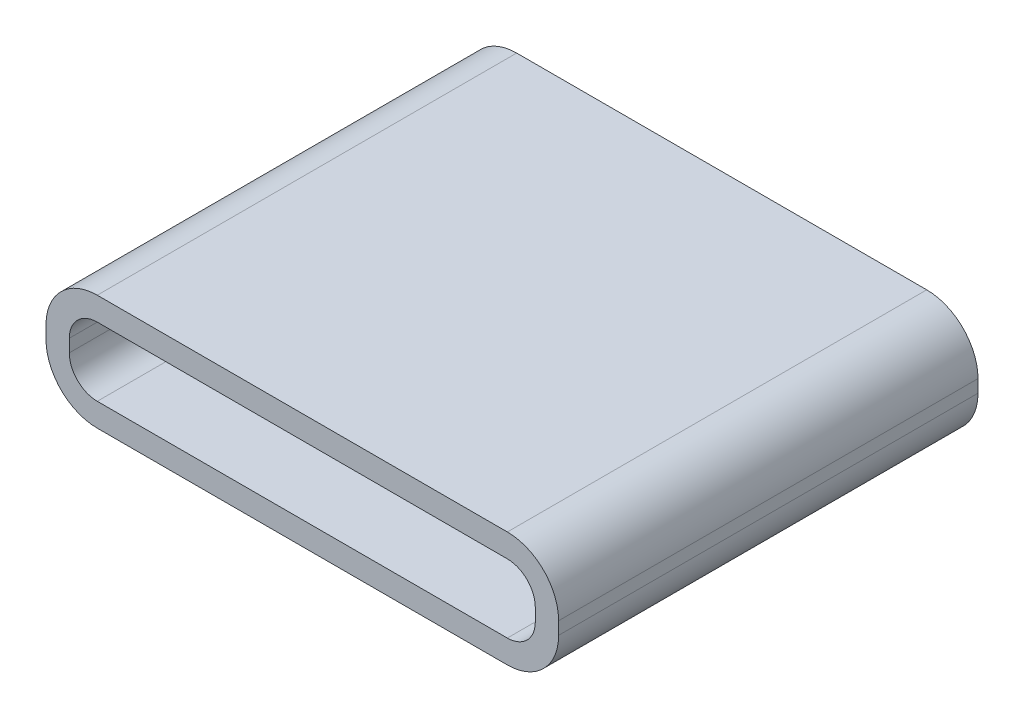
ISO-10303-21;
HEADER;
FILE_DESCRIPTION(('STEP AP214'),'2;1');
FILE_NAME('part.step','',(''),(''),'','','');
FILE_SCHEMA(('AUTOMOTIVE_DESIGN { 1 0 10303 214 1 1 1 1 }'));
ENDSEC;
DATA;
#1=APPLICATION_CONTEXT('core data for automotive mechanical design processes');
#2=APPLICATION_PROTOCOL_DEFINITION('international standard','automotive_design',2000,#1);
#3=PRODUCT_CONTEXT('',#1,'mechanical');
#4=PRODUCT('Part','Part','',(#3));
#5=PRODUCT_RELATED_PRODUCT_CATEGORY('part','',(#4));
#6=PRODUCT_DEFINITION_FORMATION('','',#4);
#7=PRODUCT_DEFINITION_CONTEXT('part definition',#1,'design');
#8=PRODUCT_DEFINITION('design','',#6,#7);
#9=PRODUCT_DEFINITION_SHAPE('','',#8);
#10=(LENGTH_UNIT() NAMED_UNIT(*) SI_UNIT(.MILLI.,.METRE.));
#11=(NAMED_UNIT(*) PLANE_ANGLE_UNIT() SI_UNIT($,.RADIAN.));
#12=(NAMED_UNIT(*) SI_UNIT($,.STERADIAN.) SOLID_ANGLE_UNIT());
#13=UNCERTAINTY_MEASURE_WITH_UNIT(LENGTH_MEASURE(1.E-05),#10,'distance_accuracy_value','');
#14=(GEOMETRIC_REPRESENTATION_CONTEXT(3) GLOBAL_UNCERTAINTY_ASSIGNED_CONTEXT((#13)) GLOBAL_UNIT_ASSIGNED_CONTEXT((#10,
#11,#12)) REPRESENTATION_CONTEXT('',''));
#15=CARTESIAN_POINT('',(0.,0.,0.));
#16=DIRECTION('',(0.,0.,1.));
#17=DIRECTION('',(1.,0.,0.));
#18=AXIS2_PLACEMENT_3D('',#15,#16,#17);
#19=CARTESIAN_POINT('',(5.,18.5812085158056,450.));
#20=DIRECTION('',(0.,0.,-1.));
#21=DIRECTION('',(-1.,0.,0.));
#22=AXIS2_PLACEMENT_3D('',#19,#20,#21);
#23=PLANE('',#22);
#24=CARTESIAN_POINT('',(5.,18.5812085158056,450.));
#25=DIRECTION('',(0.,0.,1.));
#26=DIRECTION('',(-1.,0.,0.));
#27=AXIS2_PLACEMENT_3D('',#24,#25,#26);
#28=CIRCLE('',#27,55.);
#29=CARTESIAN_POINT('',(5.,73.5812085158056,450.));
#30=VERTEX_POINT('',#29);
#31=CARTESIAN_POINT('',(-50.,18.5812085158056,450.));
#32=VERTEX_POINT('',#31);
#33=EDGE_CURVE('E248',#30,#32,#28,.T.);
#34=ORIENTED_EDGE('',*,*,#33,.T.);
#35=DIRECTION('',(0.,-1.,0.));
#36=VECTOR('',#35,1.);
#37=CARTESIAN_POINT('',(-50.,18.5812085158056,450.));
#38=LINE('',#37,#36);
#39=CARTESIAN_POINT('',(-50.,5.,450.));
#40=VERTEX_POINT('',#39);
#41=EDGE_CURVE('E252',#32,#40,#38,.T.);
#42=ORIENTED_EDGE('',*,*,#41,.T.);
#43=CARTESIAN_POINT('',(5.,5.,450.));
#44=DIRECTION('',(0.,0.,1.));
#45=DIRECTION('',(-1.,0.,0.));
#46=AXIS2_PLACEMENT_3D('',#43,#44,#45);
#47=CIRCLE('',#46,55.);
#48=CARTESIAN_POINT('',(5.,-50.,450.));
#49=VERTEX_POINT('',#48);
#50=EDGE_CURVE('E256',#40,#49,#47,.T.);
#51=ORIENTED_EDGE('',*,*,#50,.T.);
#52=DIRECTION('',(1.,0.,0.));
#53=VECTOR('',#52,1.);
#54=CARTESIAN_POINT('',(5.,-50.,450.));
#55=LINE('',#54,#53);
#56=CARTESIAN_POINT('',(445.,-50.,450.));
#57=VERTEX_POINT('',#56);
#58=EDGE_CURVE('E259',#49,#57,#55,.T.);
#59=ORIENTED_EDGE('',*,*,#58,.T.);
#60=CARTESIAN_POINT('',(445.,5.,450.));
#61=DIRECTION('',(0.,0.,1.));
#62=DIRECTION('',(-1.,0.,0.));
#63=AXIS2_PLACEMENT_3D('',#60,#61,#62);
#64=CIRCLE('',#63,55.);
#65=CARTESIAN_POINT('',(500.,5.00000000000001,450.));
#66=VERTEX_POINT('',#65);
#67=EDGE_CURVE('E262',#57,#66,#64,.T.);
#68=ORIENTED_EDGE('',*,*,#67,.T.);
#69=DIRECTION('',(0.,1.,0.));
#70=VECTOR('',#69,1.);
#71=CARTESIAN_POINT('',(500.,18.5812085158056,450.));
#72=LINE('',#71,#70);
#73=CARTESIAN_POINT('',(500.,18.5812085158056,450.));
#74=VERTEX_POINT('',#73);
#75=EDGE_CURVE('E265',#66,#74,#72,.T.);
#76=ORIENTED_EDGE('',*,*,#75,.T.);
#77=CARTESIAN_POINT('',(445.,18.5812085158056,450.));
#78=DIRECTION('',(0.,0.,1.));
#79=DIRECTION('',(1.,0.,0.));
#80=AXIS2_PLACEMENT_3D('',#77,#78,#79);
#81=CIRCLE('',#80,55.);
#82=CARTESIAN_POINT('',(445.,73.5812085158056,450.));
#83=VERTEX_POINT('',#82);
#84=EDGE_CURVE('E268',#74,#83,#81,.T.);
#85=ORIENTED_EDGE('',*,*,#84,.T.);
#86=DIRECTION('',(-1.,0.,0.));
#87=VECTOR('',#86,1.);
#88=CARTESIAN_POINT('',(5.,73.5812085158056,450.));
#89=LINE('',#88,#87);
#90=EDGE_CURVE('E271',#83,#30,#89,.T.);
#91=ORIENTED_EDGE('',*,*,#90,.T.);
#92=EDGE_LOOP('',(#34,#42,#51,#59,#68,#76,#85,#91));
#93=FACE_BOUND('',#92,.T.);
#94=CARTESIAN_POINT('',(5.,18.5812085158056,450.));
#95=DIRECTION('',(0.,0.,1.));
#96=DIRECTION('',(-1.,0.,0.));
#97=AXIS2_PLACEMENT_3D('',#94,#95,#96);
#98=CIRCLE('',#97,30.);
#99=CARTESIAN_POINT('',(5.00000000000004,48.5812085158056,450.));
#100=VERTEX_POINT('',#99);
#101=CARTESIAN_POINT('',(-25.,18.5812085158056,450.));
#102=VERTEX_POINT('',#101);
#103=EDGE_CURVE('E157',#100,#102,#98,.T.);
#104=ORIENTED_EDGE('',*,*,#103,.F.);
#105=DIRECTION('',(-1.,0.,0.));
#106=VECTOR('',#105,1.);
#107=CARTESIAN_POINT('',(5.00000000000004,48.5812085158056,450.));
#108=LINE('',#107,#106);
#109=CARTESIAN_POINT('',(445.,48.5812085158056,450.));
#110=VERTEX_POINT('',#109);
#111=EDGE_CURVE('E201',#110,#100,#108,.T.);
#112=ORIENTED_EDGE('',*,*,#111,.F.);
#113=CARTESIAN_POINT('',(445.,18.5812085158056,450.));
#114=DIRECTION('',(0.,0.,1.));
#115=DIRECTION('',(1.,0.,0.));
#116=AXIS2_PLACEMENT_3D('',#113,#114,#115);
#117=CIRCLE('',#116,30.);
#118=CARTESIAN_POINT('',(475.,18.5812085158056,450.));
#119=VERTEX_POINT('',#118);
#120=EDGE_CURVE('E198',#119,#110,#117,.T.);
#121=ORIENTED_EDGE('',*,*,#120,.F.);
#122=DIRECTION('',(0.,1.,0.));
#123=VECTOR('',#122,1.);
#124=CARTESIAN_POINT('',(475.,18.5812085158056,450.));
#125=LINE('',#124,#123);
#126=CARTESIAN_POINT('',(475.,5.,450.));
#127=VERTEX_POINT('',#126);
#128=EDGE_CURVE('E195',#127,#119,#125,.T.);
#129=ORIENTED_EDGE('',*,*,#128,.F.);
#130=CARTESIAN_POINT('',(445.,5.,450.));
#131=DIRECTION('',(0.,0.,1.));
#132=DIRECTION('',(-1.,0.,0.));
#133=AXIS2_PLACEMENT_3D('',#130,#131,#132);
#134=CIRCLE('',#133,30.);
#135=CARTESIAN_POINT('',(445.,-25.,450.));
#136=VERTEX_POINT('',#135);
#137=EDGE_CURVE('E192',#136,#127,#134,.T.);
#138=ORIENTED_EDGE('',*,*,#137,.F.);
#139=DIRECTION('',(1.,0.,0.));
#140=VECTOR('',#139,1.);
#141=CARTESIAN_POINT('',(5.00000000000004,-25.,450.));
#142=LINE('',#141,#140);
#143=CARTESIAN_POINT('',(5.00000000000004,-25.,450.));
#144=VERTEX_POINT('',#143);
#145=EDGE_CURVE('E187',#144,#136,#142,.T.);
#146=ORIENTED_EDGE('',*,*,#145,.F.);
#147=CARTESIAN_POINT('',(5.,5.,450.));
#148=DIRECTION('',(0.,0.,1.));
#149=DIRECTION('',(-1.,0.,0.));
#150=AXIS2_PLACEMENT_3D('',#147,#148,#149);
#151=CIRCLE('',#150,30.);
#152=CARTESIAN_POINT('',(-25.,5.,450.));
#153=VERTEX_POINT('',#152);
#154=EDGE_CURVE('E180',#153,#144,#151,.T.);
#155=ORIENTED_EDGE('',*,*,#154,.F.);
#156=DIRECTION('',(0.,-1.,0.));
#157=VECTOR('',#156,1.);
#158=CARTESIAN_POINT('',(-25.,18.5812085158056,450.));
#159=LINE('',#158,#157);
#160=EDGE_CURVE('E166',#102,#153,#159,.T.);
#161=ORIENTED_EDGE('',*,*,#160,.F.);
#162=EDGE_LOOP('',(#104,#112,#121,#129,#138,#146,#155,#161));
#163=FACE_BOUND('',#162,.T.);
#164=ADVANCED_FACE('F43',(#93,#163),#23,.F.);
#165=CARTESIAN_POINT('',(5.,18.5812085158056,0.));
#166=DIRECTION('',(0.,0.,-1.));
#167=DIRECTION('',(-1.,0.,0.));
#168=AXIS2_PLACEMENT_3D('',#165,#166,#167);
#169=PLANE('',#168);
#170=CARTESIAN_POINT('',(5.,18.5812085158056,0.));
#171=DIRECTION('',(0.,0.,1.));
#172=DIRECTION('',(-1.,0.,0.));
#173=AXIS2_PLACEMENT_3D('',#170,#171,#172);
#174=CIRCLE('',#173,55.);
#175=CARTESIAN_POINT('',(5.,73.5812085158056,0.));
#176=VERTEX_POINT('',#175);
#177=CARTESIAN_POINT('',(-50.,18.5812085158056,0.));
#178=VERTEX_POINT('',#177);
#179=EDGE_CURVE('E175',#176,#178,#174,.T.);
#180=ORIENTED_EDGE('',*,*,#179,.F.);
#181=DIRECTION('',(-1.,0.,0.));
#182=VECTOR('',#181,1.);
#183=CARTESIAN_POINT('',(5.,73.5812085158056,0.));
#184=LINE('',#183,#182);
#185=CARTESIAN_POINT('',(445.,73.5812085158056,0.));
#186=VERTEX_POINT('',#185);
#187=EDGE_CURVE('E253',#186,#176,#184,.T.);
#188=ORIENTED_EDGE('',*,*,#187,.F.);
#189=CARTESIAN_POINT('',(445.,18.5812085158056,0.));
#190=DIRECTION('',(0.,0.,1.));
#191=DIRECTION('',(1.,0.,0.));
#192=AXIS2_PLACEMENT_3D('',#189,#190,#191);
#193=CIRCLE('',#192,55.);
#194=CARTESIAN_POINT('',(500.,18.5812085158056,0.));
#195=VERTEX_POINT('',#194);
#196=EDGE_CURVE('E292',#195,#186,#193,.T.);
#197=ORIENTED_EDGE('',*,*,#196,.F.);
#198=DIRECTION('',(0.,1.,0.));
#199=VECTOR('',#198,1.);
#200=CARTESIAN_POINT('',(500.,18.5812085158056,0.));
#201=LINE('',#200,#199);
#202=CARTESIAN_POINT('',(500.,5.00000000000001,0.));
#203=VERTEX_POINT('',#202);
#204=EDGE_CURVE('E289',#203,#195,#201,.T.);
#205=ORIENTED_EDGE('',*,*,#204,.F.);
#206=CARTESIAN_POINT('',(445.,5.,0.));
#207=DIRECTION('',(0.,0.,1.));
#208=DIRECTION('',(-1.,0.,0.));
#209=AXIS2_PLACEMENT_3D('',#206,#207,#208);
#210=CIRCLE('',#209,55.);
#211=CARTESIAN_POINT('',(445.,-50.,0.));
#212=VERTEX_POINT('',#211);
#213=EDGE_CURVE('E286',#212,#203,#210,.T.);
#214=ORIENTED_EDGE('',*,*,#213,.F.);
#215=DIRECTION('',(1.,0.,0.));
#216=VECTOR('',#215,1.);
#217=CARTESIAN_POINT('',(5.,-50.,0.));
#218=LINE('',#217,#216);
#219=CARTESIAN_POINT('',(5.,-50.,0.));
#220=VERTEX_POINT('',#219);
#221=EDGE_CURVE('E284',#220,#212,#218,.T.);
#222=ORIENTED_EDGE('',*,*,#221,.F.);
#223=CARTESIAN_POINT('',(5.,5.,0.));
#224=DIRECTION('',(0.,0.,1.));
#225=DIRECTION('',(-1.,0.,0.));
#226=AXIS2_PLACEMENT_3D('',#223,#224,#225);
#227=CIRCLE('',#226,55.);
#228=CARTESIAN_POINT('',(-50.,5.,0.));
#229=VERTEX_POINT('',#228);
#230=EDGE_CURVE('E281',#229,#220,#227,.T.);
#231=ORIENTED_EDGE('',*,*,#230,.F.);
#232=DIRECTION('',(0.,-1.,0.));
#233=VECTOR('',#232,1.);
#234=CARTESIAN_POINT('',(-50.,18.5812085158056,0.));
#235=LINE('',#234,#233);
#236=EDGE_CURVE('E278',#178,#229,#235,.T.);
#237=ORIENTED_EDGE('',*,*,#236,.F.);
#238=EDGE_LOOP('',(#180,#188,#197,#205,#214,#222,#231,#237));
#239=FACE_BOUND('',#238,.T.);
#240=DIRECTION('',(-1.,0.,0.));
#241=VECTOR('',#240,1.);
#242=CARTESIAN_POINT('',(5.00000000000004,48.5812085158056,0.));
#243=LINE('',#242,#241);
#244=CARTESIAN_POINT('',(445.,48.5812085158056,0.));
#245=VERTEX_POINT('',#244);
#246=CARTESIAN_POINT('',(5.00000000000004,48.5812085158056,0.));
#247=VERTEX_POINT('',#246);
#248=EDGE_CURVE('E167',#245,#247,#243,.T.);
#249=ORIENTED_EDGE('',*,*,#248,.T.);
#250=CARTESIAN_POINT('',(5.,18.5812085158056,0.));
#251=DIRECTION('',(0.,0.,1.));
#252=DIRECTION('',(-1.,0.,0.));
#253=AXIS2_PLACEMENT_3D('',#250,#251,#252);
#254=CIRCLE('',#253,30.);
#255=CARTESIAN_POINT('',(-25.,18.5812085158056,0.));
#256=VERTEX_POINT('',#255);
#257=EDGE_CURVE('E67',#247,#256,#254,.T.);
#258=ORIENTED_EDGE('',*,*,#257,.T.);
#259=DIRECTION('',(0.,-1.,0.));
#260=VECTOR('',#259,1.);
#261=CARTESIAN_POINT('',(-25.,18.5812085158056,0.));
#262=LINE('',#261,#260);
#263=CARTESIAN_POINT('',(-25.,5.,0.));
#264=VERTEX_POINT('',#263);
#265=EDGE_CURVE('E173',#256,#264,#262,.T.);
#266=ORIENTED_EDGE('',*,*,#265,.T.);
#267=CARTESIAN_POINT('',(5.,5.,0.));
#268=DIRECTION('',(0.,0.,1.));
#269=DIRECTION('',(-1.,0.,0.));
#270=AXIS2_PLACEMENT_3D('',#267,#268,#269);
#271=CIRCLE('',#270,30.);
#272=CARTESIAN_POINT('',(5.00000000000004,-25.,0.));
#273=VERTEX_POINT('',#272);
#274=EDGE_CURVE('E208',#264,#273,#271,.T.);
#275=ORIENTED_EDGE('',*,*,#274,.T.);
#276=DIRECTION('',(1.,0.,0.));
#277=VECTOR('',#276,1.);
#278=CARTESIAN_POINT('',(5.00000000000004,-25.,0.));
#279=LINE('',#278,#277);
#280=CARTESIAN_POINT('',(445.,-25.,0.));
#281=VERTEX_POINT('',#280);
#282=EDGE_CURVE('E212',#273,#281,#279,.T.);
#283=ORIENTED_EDGE('',*,*,#282,.T.);
#284=CARTESIAN_POINT('',(445.,5.,0.));
#285=DIRECTION('',(0.,0.,1.));
#286=DIRECTION('',(-1.,0.,0.));
#287=AXIS2_PLACEMENT_3D('',#284,#285,#286);
#288=CIRCLE('',#287,30.);
#289=CARTESIAN_POINT('',(475.,5.,0.));
#290=VERTEX_POINT('',#289);
#291=EDGE_CURVE('E216',#281,#290,#288,.T.);
#292=ORIENTED_EDGE('',*,*,#291,.T.);
#293=DIRECTION('',(0.,1.,0.));
#294=VECTOR('',#293,1.);
#295=CARTESIAN_POINT('',(475.,18.5812085158056,0.));
#296=LINE('',#295,#294);
#297=CARTESIAN_POINT('',(475.,18.5812085158056,0.));
#298=VERTEX_POINT('',#297);
#299=EDGE_CURVE('E220',#290,#298,#296,.T.);
#300=ORIENTED_EDGE('',*,*,#299,.T.);
#301=CARTESIAN_POINT('',(445.,18.5812085158056,0.));
#302=DIRECTION('',(0.,0.,1.));
#303=DIRECTION('',(1.,0.,0.));
#304=AXIS2_PLACEMENT_3D('',#301,#302,#303);
#305=CIRCLE('',#304,30.);
#306=EDGE_CURVE('E224',#298,#245,#305,.T.);
#307=ORIENTED_EDGE('',*,*,#306,.T.);
#308=EDGE_LOOP('',(#249,#258,#266,#275,#283,#292,#300,#307));
#309=FACE_BOUND('',#308,.T.);
#310=ADVANCED_FACE('F332',(#239,#309),#169,.T.);
#311=CARTESIAN_POINT('',(5.,18.5812085158056,450.));
#312=DIRECTION('',(0.,0.,-1.));
#313=DIRECTION('',(-1.,0.,0.));
#314=AXIS2_PLACEMENT_3D('',#311,#312,#313);
#315=CYLINDRICAL_SURFACE('',#314,55.);
#316=ORIENTED_EDGE('',*,*,#179,.T.);
#317=DIRECTION('',(0.,0.,-1.));
#318=VECTOR('',#317,1.);
#319=CARTESIAN_POINT('',(-50.,18.5812085158056,450.));
#320=LINE('',#319,#318);
#321=EDGE_CURVE('E11',#32,#178,#320,.T.);
#322=ORIENTED_EDGE('',*,*,#321,.F.);
#323=ORIENTED_EDGE('',*,*,#33,.F.);
#324=DIRECTION('',(0.,0.,-1.));
#325=VECTOR('',#324,1.);
#326=CARTESIAN_POINT('',(5.,73.5812085158056,450.));
#327=LINE('',#326,#325);
#328=EDGE_CURVE('E274',#30,#176,#327,.T.);
#329=ORIENTED_EDGE('',*,*,#328,.T.);
#330=EDGE_LOOP('',(#316,#322,#323,#329));
#331=FACE_BOUND('',#330,.T.);
#332=ADVANCED_FACE('F45',(#331),#315,.T.);
#333=CARTESIAN_POINT('',(-50.,18.5812085158056,450.));
#334=DIRECTION('',(1.,0.,0.));
#335=DIRECTION('',(0.,1.,0.));
#336=AXIS2_PLACEMENT_3D('',#333,#334,#335);
#337=PLANE('',#336);
#338=ORIENTED_EDGE('',*,*,#236,.T.);
#339=DIRECTION('',(0.,0.,-1.));
#340=VECTOR('',#339,1.);
#341=CARTESIAN_POINT('',(-50.,5.,450.));
#342=LINE('',#341,#340);
#343=EDGE_CURVE('E52',#40,#229,#342,.T.);
#344=ORIENTED_EDGE('',*,*,#343,.F.);
#345=ORIENTED_EDGE('',*,*,#41,.F.);
#346=ORIENTED_EDGE('',*,*,#321,.T.);
#347=EDGE_LOOP('',(#338,#344,#345,#346));
#348=FACE_BOUND('',#347,.T.);
#349=ADVANCED_FACE('F349',(#348),#337,.F.);
#350=CARTESIAN_POINT('',(5.,5.,450.));
#351=DIRECTION('',(0.,0.,-1.));
#352=DIRECTION('',(-1.,0.,0.));
#353=AXIS2_PLACEMENT_3D('',#350,#351,#352);
#354=CYLINDRICAL_SURFACE('',#353,55.);
#355=ORIENTED_EDGE('',*,*,#230,.T.);
#356=DIRECTION('',(0.,0.,-1.));
#357=VECTOR('',#356,1.);
#358=CARTESIAN_POINT('',(5.,-50.,450.));
#359=LINE('',#358,#357);
#360=EDGE_CURVE('E316',#49,#220,#359,.T.);
#361=ORIENTED_EDGE('',*,*,#360,.F.);
#362=ORIENTED_EDGE('',*,*,#50,.F.);
#363=ORIENTED_EDGE('',*,*,#343,.T.);
#364=EDGE_LOOP('',(#355,#361,#362,#363));
#365=FACE_BOUND('',#364,.T.);
#366=ADVANCED_FACE('F326',(#365),#354,.T.);
#367=CARTESIAN_POINT('',(5.,-50.,450.));
#368=DIRECTION('',(0.,1.,0.));
#369=DIRECTION('',(0.,0.,1.));
#370=AXIS2_PLACEMENT_3D('',#367,#368,#369);
#371=PLANE('',#370);
#372=ORIENTED_EDGE('',*,*,#221,.T.);
#373=DIRECTION('',(0.,0.,-1.));
#374=VECTOR('',#373,1.);
#375=CARTESIAN_POINT('',(445.,-50.,450.));
#376=LINE('',#375,#374);
#377=EDGE_CURVE('E312',#57,#212,#376,.T.);
#378=ORIENTED_EDGE('',*,*,#377,.F.);
#379=ORIENTED_EDGE('',*,*,#58,.F.);
#380=ORIENTED_EDGE('',*,*,#360,.T.);
#381=EDGE_LOOP('',(#372,#378,#379,#380));
#382=FACE_BOUND('',#381,.T.);
#383=ADVANCED_FACE('F338',(#382),#371,.F.);
#384=CARTESIAN_POINT('',(445.,5.,450.));
#385=DIRECTION('',(0.,0.,-1.));
#386=DIRECTION('',(-1.,0.,0.));
#387=AXIS2_PLACEMENT_3D('',#384,#385,#386);
#388=CYLINDRICAL_SURFACE('',#387,55.);
#389=ORIENTED_EDGE('',*,*,#213,.T.);
#390=DIRECTION('',(0.,0.,-1.));
#391=VECTOR('',#390,1.);
#392=CARTESIAN_POINT('',(500.,5.00000000000001,450.));
#393=LINE('',#392,#391);
#394=EDGE_CURVE('E308',#66,#203,#393,.T.);
#395=ORIENTED_EDGE('',*,*,#394,.F.);
#396=ORIENTED_EDGE('',*,*,#67,.F.);
#397=ORIENTED_EDGE('',*,*,#377,.T.);
#398=EDGE_LOOP('',(#389,#395,#396,#397));
#399=FACE_BOUND('',#398,.T.);
#400=ADVANCED_FACE('F342',(#399),#388,.T.);
#401=CARTESIAN_POINT('',(500.,18.5812085158056,450.));
#402=DIRECTION('',(-1.,0.,0.));
#403=DIRECTION('',(0.,0.,1.));
#404=AXIS2_PLACEMENT_3D('',#401,#402,#403);
#405=PLANE('',#404);
#406=ORIENTED_EDGE('',*,*,#204,.T.);
#407=DIRECTION('',(0.,0.,-1.));
#408=VECTOR('',#407,1.);
#409=CARTESIAN_POINT('',(500.,18.5812085158056,450.));
#410=LINE('',#409,#408);
#411=EDGE_CURVE('E304',#74,#195,#410,.T.);
#412=ORIENTED_EDGE('',*,*,#411,.F.);
#413=ORIENTED_EDGE('',*,*,#75,.F.);
#414=ORIENTED_EDGE('',*,*,#394,.T.);
#415=EDGE_LOOP('',(#406,#412,#413,#414));
#416=FACE_BOUND('',#415,.T.);
#417=ADVANCED_FACE('F362',(#416),#405,.F.);
#418=CARTESIAN_POINT('',(445.,18.5812085158056,450.));
#419=DIRECTION('',(0.,0.,-1.));
#420=DIRECTION('',(-1.,0.,0.));
#421=AXIS2_PLACEMENT_3D('',#418,#419,#420);
#422=CYLINDRICAL_SURFACE('',#421,55.);
#423=ORIENTED_EDGE('',*,*,#196,.T.);
#424=DIRECTION('',(0.,0.,-1.));
#425=VECTOR('',#424,1.);
#426=CARTESIAN_POINT('',(445.,73.5812085158056,450.));
#427=LINE('',#426,#425);
#428=EDGE_CURVE('E300',#83,#186,#427,.T.);
#429=ORIENTED_EDGE('',*,*,#428,.F.);
#430=ORIENTED_EDGE('',*,*,#84,.F.);
#431=ORIENTED_EDGE('',*,*,#411,.T.);
#432=EDGE_LOOP('',(#423,#429,#430,#431));
#433=FACE_BOUND('',#432,.T.);
#434=ADVANCED_FACE('F360',(#433),#422,.T.);
#435=CARTESIAN_POINT('',(5.,73.5812085158056,450.));
#436=DIRECTION('',(0.,-1.,0.));
#437=DIRECTION('',(0.,0.,-1.));
#438=AXIS2_PLACEMENT_3D('',#435,#436,#437);
#439=PLANE('',#438);
#440=ORIENTED_EDGE('',*,*,#187,.T.);
#441=ORIENTED_EDGE('',*,*,#328,.F.);
#442=ORIENTED_EDGE('',*,*,#90,.F.);
#443=ORIENTED_EDGE('',*,*,#428,.T.);
#444=EDGE_LOOP('',(#440,#441,#442,#443));
#445=FACE_BOUND('',#444,.T.);
#446=ADVANCED_FACE('F355',(#445),#439,.F.);
#447=CARTESIAN_POINT('',(5.,18.5812085158056,450.));
#448=DIRECTION('',(0.,0.,-1.));
#449=DIRECTION('',(-1.,0.,0.));
#450=AXIS2_PLACEMENT_3D('',#447,#448,#449);
#451=CYLINDRICAL_SURFACE('',#450,30.);
#452=ORIENTED_EDGE('',*,*,#257,.F.);
#453=DIRECTION('',(0.,0.,-1.));
#454=VECTOR('',#453,1.);
#455=CARTESIAN_POINT('',(5.00000000000004,48.5812085158056,450.));
#456=LINE('',#455,#454);
#457=EDGE_CURVE('E161',#100,#247,#456,.T.);
#458=ORIENTED_EDGE('',*,*,#457,.F.);
#459=ORIENTED_EDGE('',*,*,#103,.T.);
#460=DIRECTION('',(0.,0.,-1.));
#461=VECTOR('',#460,1.);
#462=CARTESIAN_POINT('',(-25.,18.5812085158056,450.));
#463=LINE('',#462,#461);
#464=EDGE_CURVE('E160',#102,#256,#463,.T.);
#465=ORIENTED_EDGE('',*,*,#464,.T.);
#466=EDGE_LOOP('',(#452,#458,#459,#465));
#467=FACE_BOUND('',#466,.T.);
#468=ADVANCED_FACE('F159',(#467),#451,.F.);
#469=CARTESIAN_POINT('',(-25.,18.5812085158056,450.));
#470=DIRECTION('',(1.,0.,0.));
#471=DIRECTION('',(0.,1.,0.));
#472=AXIS2_PLACEMENT_3D('',#469,#470,#471);
#473=PLANE('',#472);
#474=ORIENTED_EDGE('',*,*,#265,.F.);
#475=ORIENTED_EDGE('',*,*,#464,.F.);
#476=ORIENTED_EDGE('',*,*,#160,.T.);
#477=DIRECTION('',(0.,0.,-1.));
#478=VECTOR('',#477,1.);
#479=CARTESIAN_POINT('',(-25.,5.,450.));
#480=LINE('',#479,#478);
#481=EDGE_CURVE('E176',#153,#264,#480,.T.);
#482=ORIENTED_EDGE('',*,*,#481,.T.);
#483=EDGE_LOOP('',(#474,#475,#476,#482));
#484=FACE_BOUND('',#483,.T.);
#485=ADVANCED_FACE('F170',(#484),#473,.T.);
#486=CARTESIAN_POINT('',(5.,5.,450.));
#487=DIRECTION('',(0.,0.,-1.));
#488=DIRECTION('',(-1.,0.,0.));
#489=AXIS2_PLACEMENT_3D('',#486,#487,#488);
#490=CYLINDRICAL_SURFACE('',#489,30.);
#491=ORIENTED_EDGE('',*,*,#274,.F.);
#492=ORIENTED_EDGE('',*,*,#481,.F.);
#493=ORIENTED_EDGE('',*,*,#154,.T.);
#494=DIRECTION('',(0.,0.,-1.));
#495=VECTOR('',#494,1.);
#496=CARTESIAN_POINT('',(5.00000000000004,-25.,450.));
#497=LINE('',#496,#495);
#498=EDGE_CURVE('E243',#144,#273,#497,.T.);
#499=ORIENTED_EDGE('',*,*,#498,.T.);
#500=EDGE_LOOP('',(#491,#492,#493,#499));
#501=FACE_BOUND('',#500,.T.);
#502=ADVANCED_FACE('F387',(#501),#490,.F.);
#503=CARTESIAN_POINT('',(5.00000000000004,-25.,450.));
#504=DIRECTION('',(0.,1.,0.));
#505=DIRECTION('',(-1.,0.,0.));
#506=AXIS2_PLACEMENT_3D('',#503,#504,#505);
#507=PLANE('',#506);
#508=ORIENTED_EDGE('',*,*,#282,.F.);
#509=ORIENTED_EDGE('',*,*,#498,.F.);
#510=ORIENTED_EDGE('',*,*,#145,.T.);
#511=DIRECTION('',(0.,0.,-1.));
#512=VECTOR('',#511,1.);
#513=CARTESIAN_POINT('',(445.,-25.,450.));
#514=LINE('',#513,#512);
#515=EDGE_CURVE('E240',#136,#281,#514,.T.);
#516=ORIENTED_EDGE('',*,*,#515,.T.);
#517=EDGE_LOOP('',(#508,#509,#510,#516));
#518=FACE_BOUND('',#517,.T.);
#519=ADVANCED_FACE('F391',(#518),#507,.T.);
#520=CARTESIAN_POINT('',(445.,5.,450.));
#521=DIRECTION('',(0.,0.,-1.));
#522=DIRECTION('',(-1.,0.,0.));
#523=AXIS2_PLACEMENT_3D('',#520,#521,#522);
#524=CYLINDRICAL_SURFACE('',#523,30.);
#525=ORIENTED_EDGE('',*,*,#291,.F.);
#526=ORIENTED_EDGE('',*,*,#515,.F.);
#527=ORIENTED_EDGE('',*,*,#137,.T.);
#528=DIRECTION('',(0.,0.,-1.));
#529=VECTOR('',#528,1.);
#530=CARTESIAN_POINT('',(475.,5.,450.));
#531=LINE('',#530,#529);
#532=EDGE_CURVE('E237',#127,#290,#531,.T.);
#533=ORIENTED_EDGE('',*,*,#532,.T.);
#534=EDGE_LOOP('',(#525,#526,#527,#533));
#535=FACE_BOUND('',#534,.T.);
#536=ADVANCED_FACE('F397',(#535),#524,.F.);
#537=CARTESIAN_POINT('',(475.,18.5812085158056,450.));
#538=DIRECTION('',(-1.,0.,0.));
#539=DIRECTION('',(0.,0.,1.));
#540=AXIS2_PLACEMENT_3D('',#537,#538,#539);
#541=PLANE('',#540);
#542=ORIENTED_EDGE('',*,*,#299,.F.);
#543=ORIENTED_EDGE('',*,*,#532,.F.);
#544=ORIENTED_EDGE('',*,*,#128,.T.);
#545=DIRECTION('',(0.,0.,-1.));
#546=VECTOR('',#545,1.);
#547=CARTESIAN_POINT('',(475.,18.5812085158056,450.));
#548=LINE('',#547,#546);
#549=EDGE_CURVE('E234',#119,#298,#548,.T.);
#550=ORIENTED_EDGE('',*,*,#549,.T.);
#551=EDGE_LOOP('',(#542,#543,#544,#550));
#552=FACE_BOUND('',#551,.T.);
#553=ADVANCED_FACE('F401',(#552),#541,.T.);
#554=CARTESIAN_POINT('',(445.,18.5812085158056,450.));
#555=DIRECTION('',(0.,0.,-1.));
#556=DIRECTION('',(-1.,0.,0.));
#557=AXIS2_PLACEMENT_3D('',#554,#555,#556);
#558=CYLINDRICAL_SURFACE('',#557,30.);
#559=ORIENTED_EDGE('',*,*,#306,.F.);
#560=ORIENTED_EDGE('',*,*,#549,.F.);
#561=ORIENTED_EDGE('',*,*,#120,.T.);
#562=DIRECTION('',(0.,0.,-1.));
#563=VECTOR('',#562,1.);
#564=CARTESIAN_POINT('',(445.,48.5812085158056,450.));
#565=LINE('',#564,#563);
#566=EDGE_CURVE('E59',#110,#245,#565,.T.);
#567=ORIENTED_EDGE('',*,*,#566,.T.);
#568=EDGE_LOOP('',(#559,#560,#561,#567));
#569=FACE_BOUND('',#568,.T.);
#570=ADVANCED_FACE('F405',(#569),#558,.F.);
#571=CARTESIAN_POINT('',(5.00000000000004,48.5812085158056,450.));
#572=DIRECTION('',(0.,-1.,0.));
#573=DIRECTION('',(0.,0.,-1.));
#574=AXIS2_PLACEMENT_3D('',#571,#572,#573);
#575=PLANE('',#574);
#576=ORIENTED_EDGE('',*,*,#248,.F.);
#577=ORIENTED_EDGE('',*,*,#566,.F.);
#578=ORIENTED_EDGE('',*,*,#111,.T.);
#579=ORIENTED_EDGE('',*,*,#457,.T.);
#580=EDGE_LOOP('',(#576,#577,#578,#579));
#581=FACE_BOUND('',#580,.T.);
#582=ADVANCED_FACE('F409',(#581),#575,.T.);
#583=CLOSED_SHELL('',(#164,#310,#332,#349,#366,#383,#400,#417,#434,#446,#468,#485,#502,#519,
#536,#553,#570,#582));
#584=MANIFOLD_SOLID_BREP('B2',#583);
#585=ADVANCED_BREP_SHAPE_REPRESENTATION('',(#18,#584),#14);
#586=SHAPE_DEFINITION_REPRESENTATION(#9,#585);
ENDSEC;
END-ISO-10303-21;
